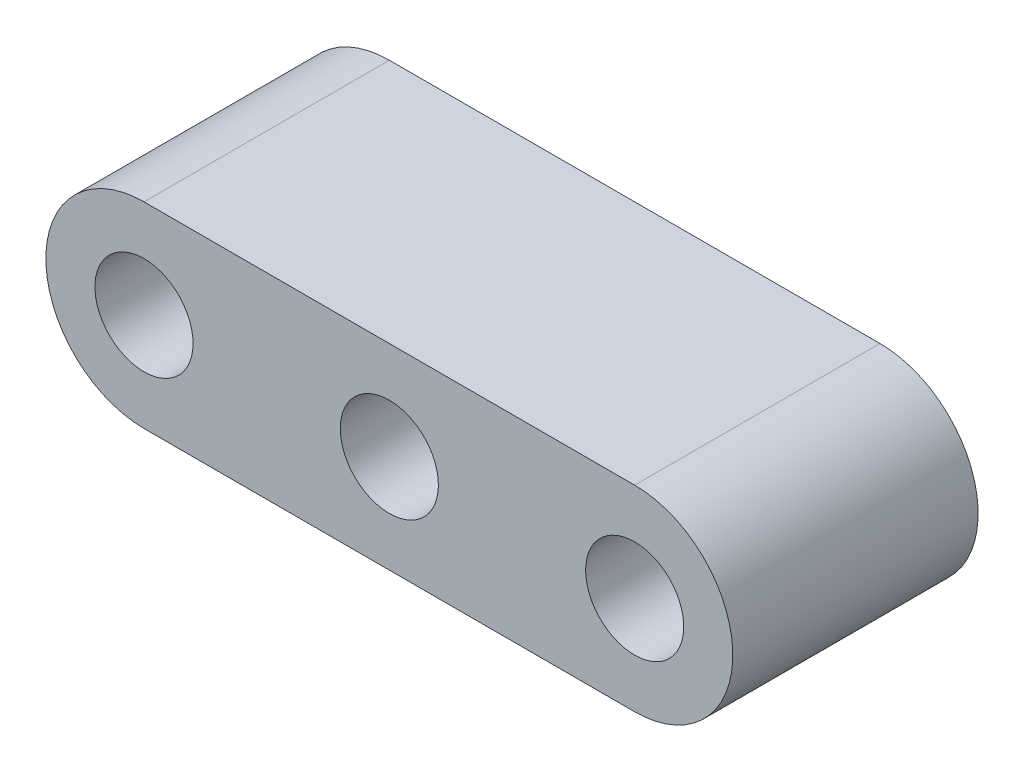
ISO-10303-21;
HEADER;
FILE_DESCRIPTION(('STEP AP214'),'2;1');
FILE_NAME('part.step','',(''),(''),'','','');
FILE_SCHEMA(('AUTOMOTIVE_DESIGN { 1 0 10303 214 1 1 1 1 }'));
ENDSEC;
DATA;
#1=APPLICATION_CONTEXT('core data for automotive mechanical design processes');
#2=APPLICATION_PROTOCOL_DEFINITION('international standard','automotive_design',2000,#1);
#3=PRODUCT_CONTEXT('',#1,'mechanical');
#4=PRODUCT('Part','Part','',(#3));
#5=PRODUCT_RELATED_PRODUCT_CATEGORY('part','',(#4));
#6=PRODUCT_DEFINITION_FORMATION('','',#4);
#7=PRODUCT_DEFINITION_CONTEXT('part definition',#1,'design');
#8=PRODUCT_DEFINITION('design','',#6,#7);
#9=PRODUCT_DEFINITION_SHAPE('','',#8);
#10=(LENGTH_UNIT() NAMED_UNIT(*) SI_UNIT(.MILLI.,.METRE.));
#11=(NAMED_UNIT(*) PLANE_ANGLE_UNIT() SI_UNIT($,.RADIAN.));
#12=(NAMED_UNIT(*) SI_UNIT($,.STERADIAN.) SOLID_ANGLE_UNIT());
#13=UNCERTAINTY_MEASURE_WITH_UNIT(LENGTH_MEASURE(1.E-05),#10,'distance_accuracy_value','');
#14=(GEOMETRIC_REPRESENTATION_CONTEXT(3) GLOBAL_UNCERTAINTY_ASSIGNED_CONTEXT((#13)) GLOBAL_UNIT_ASSIGNED_CONTEXT((#10,
#11,#12)) REPRESENTATION_CONTEXT('',''));
#15=CARTESIAN_POINT('',(0.,0.,0.));
#16=DIRECTION('',(0.,0.,1.));
#17=DIRECTION('',(1.,0.,0.));
#18=AXIS2_PLACEMENT_3D('',#15,#16,#17);
#19=CARTESIAN_POINT('',(-10.,0.,10.));
#20=DIRECTION('',(0.,0.,1.));
#21=DIRECTION('',(1.,0.,0.));
#22=AXIS2_PLACEMENT_3D('',#19,#20,#21);
#23=PLANE('',#22);
#24=CARTESIAN_POINT('',(0.,0.,10.));
#25=DIRECTION('',(0.,0.,1.));
#26=DIRECTION('',(1.,0.,0.));
#27=AXIS2_PLACEMENT_3D('',#24,#25,#26);
#28=CIRCLE('',#27,2.);
#29=CARTESIAN_POINT('',(2.,0.,10.));
#30=VERTEX_POINT('',#29);
#31=EDGE_CURVE('E116',#30,#30,#28,.T.);
#32=ORIENTED_EDGE('',*,*,#31,.F.);
#33=EDGE_LOOP('',(#32));
#34=FACE_BOUND('',#33,.T.);
#35=CARTESIAN_POINT('',(-10.,0.,10.));
#36=DIRECTION('',(0.,0.,1.));
#37=DIRECTION('',(1.,0.,0.));
#38=AXIS2_PLACEMENT_3D('',#35,#36,#37);
#39=CIRCLE('',#38,4.);
#40=CARTESIAN_POINT('',(-10.,4.,10.));
#41=VERTEX_POINT('',#40);
#42=CARTESIAN_POINT('',(-10.,-4.,10.));
#43=VERTEX_POINT('',#42);
#44=EDGE_CURVE('E86',#41,#43,#39,.T.);
#45=ORIENTED_EDGE('',*,*,#44,.T.);
#46=DIRECTION('',(1.,0.,0.));
#47=VECTOR('',#46,1.);
#48=CARTESIAN_POINT('',(-10.,-4.,10.));
#49=LINE('',#48,#47);
#50=CARTESIAN_POINT('',(10.,-4.,10.));
#51=VERTEX_POINT('',#50);
#52=EDGE_CURVE('E81',#43,#51,#49,.T.);
#53=ORIENTED_EDGE('',*,*,#52,.T.);
#54=CARTESIAN_POINT('',(10.,0.,10.));
#55=DIRECTION('',(0.,0.,1.));
#56=DIRECTION('',(-1.,0.,0.));
#57=AXIS2_PLACEMENT_3D('',#54,#55,#56);
#58=CIRCLE('',#57,4.);
#59=CARTESIAN_POINT('',(10.,4.,10.));
#60=VERTEX_POINT('',#59);
#61=EDGE_CURVE('E84',#51,#60,#58,.T.);
#62=ORIENTED_EDGE('',*,*,#61,.T.);
#63=DIRECTION('',(-1.,0.,0.));
#64=VECTOR('',#63,1.);
#65=CARTESIAN_POINT('',(-10.,4.,10.));
#66=LINE('',#65,#64);
#67=EDGE_CURVE('E51',#60,#41,#66,.T.);
#68=ORIENTED_EDGE('',*,*,#67,.T.);
#69=EDGE_LOOP('',(#45,#53,#62,#68));
#70=FACE_BOUND('',#69,.T.);
#71=CARTESIAN_POINT('',(-10.,0.,10.));
#72=DIRECTION('',(0.,0.,1.));
#73=DIRECTION('',(1.,0.,0.));
#74=AXIS2_PLACEMENT_3D('',#71,#72,#73);
#75=CIRCLE('',#74,2.);
#76=CARTESIAN_POINT('',(-8.,0.,10.));
#77=VERTEX_POINT('',#76);
#78=EDGE_CURVE('E101',#77,#77,#75,.T.);
#79=ORIENTED_EDGE('',*,*,#78,.F.);
#80=EDGE_LOOP('',(#79));
#81=FACE_BOUND('',#80,.T.);
#82=CARTESIAN_POINT('',(10.,0.,10.));
#83=DIRECTION('',(0.,0.,1.));
#84=DIRECTION('',(-1.,0.,0.));
#85=AXIS2_PLACEMENT_3D('',#82,#83,#84);
#86=CIRCLE('',#85,2.);
#87=CARTESIAN_POINT('',(8.,0.,10.));
#88=VERTEX_POINT('',#87);
#89=EDGE_CURVE('E122',#88,#88,#86,.T.);
#90=ORIENTED_EDGE('',*,*,#89,.F.);
#91=EDGE_LOOP('',(#90));
#92=FACE_BOUND('',#91,.T.);
#93=ADVANCED_FACE('F34',(#34,#70,#81,#92),#23,.T.);
#94=CARTESIAN_POINT('',(-10.,0.,0.));
#95=DIRECTION('',(0.,0.,1.));
#96=DIRECTION('',(1.,0.,0.));
#97=AXIS2_PLACEMENT_3D('',#94,#95,#96);
#98=PLANE('',#97);
#99=CARTESIAN_POINT('',(-10.,0.,0.));
#100=DIRECTION('',(0.,0.,1.));
#101=DIRECTION('',(1.,0.,0.));
#102=AXIS2_PLACEMENT_3D('',#99,#100,#101);
#103=CIRCLE('',#102,4.);
#104=CARTESIAN_POINT('',(-10.,4.,0.));
#105=VERTEX_POINT('',#104);
#106=CARTESIAN_POINT('',(-10.,-4.,0.));
#107=VERTEX_POINT('',#106);
#108=EDGE_CURVE('E98',#105,#107,#103,.T.);
#109=ORIENTED_EDGE('',*,*,#108,.F.);
#110=DIRECTION('',(-1.,0.,0.));
#111=VECTOR('',#110,1.);
#112=CARTESIAN_POINT('',(-10.,4.,0.));
#113=LINE('',#112,#111);
#114=CARTESIAN_POINT('',(10.,4.,0.));
#115=VERTEX_POINT('',#114);
#116=EDGE_CURVE('E74',#115,#105,#113,.T.);
#117=ORIENTED_EDGE('',*,*,#116,.F.);
#118=CARTESIAN_POINT('',(10.,0.,0.));
#119=DIRECTION('',(0.,0.,1.));
#120=DIRECTION('',(-1.,0.,0.));
#121=AXIS2_PLACEMENT_3D('',#118,#119,#120);
#122=CIRCLE('',#121,4.);
#123=CARTESIAN_POINT('',(10.,-4.,0.));
#124=VERTEX_POINT('',#123);
#125=EDGE_CURVE('E68',#124,#115,#122,.T.);
#126=ORIENTED_EDGE('',*,*,#125,.F.);
#127=DIRECTION('',(1.,0.,0.));
#128=VECTOR('',#127,1.);
#129=CARTESIAN_POINT('',(-10.,-4.,0.));
#130=LINE('',#129,#128);
#131=EDGE_CURVE('E90',#107,#124,#130,.T.);
#132=ORIENTED_EDGE('',*,*,#131,.F.);
#133=EDGE_LOOP('',(#109,#117,#126,#132));
#134=FACE_BOUND('',#133,.T.);
#135=CARTESIAN_POINT('',(-10.,0.,0.));
#136=DIRECTION('',(0.,0.,1.));
#137=DIRECTION('',(1.,0.,0.));
#138=AXIS2_PLACEMENT_3D('',#135,#136,#137);
#139=CIRCLE('',#138,2.);
#140=CARTESIAN_POINT('',(-8.,0.,0.));
#141=VERTEX_POINT('',#140);
#142=EDGE_CURVE('E113',#141,#141,#139,.T.);
#143=ORIENTED_EDGE('',*,*,#142,.T.);
#144=EDGE_LOOP('',(#143));
#145=FACE_BOUND('',#144,.T.);
#146=CARTESIAN_POINT('',(0.,0.,0.));
#147=DIRECTION('',(0.,0.,1.));
#148=DIRECTION('',(1.,0.,0.));
#149=AXIS2_PLACEMENT_3D('',#146,#147,#148);
#150=CIRCLE('',#149,2.);
#151=CARTESIAN_POINT('',(2.,0.,0.));
#152=VERTEX_POINT('',#151);
#153=EDGE_CURVE('E119',#152,#152,#150,.T.);
#154=ORIENTED_EDGE('',*,*,#153,.T.);
#155=EDGE_LOOP('',(#154));
#156=FACE_BOUND('',#155,.T.);
#157=CARTESIAN_POINT('',(10.,0.,0.));
#158=DIRECTION('',(0.,0.,1.));
#159=DIRECTION('',(-1.,0.,0.));
#160=AXIS2_PLACEMENT_3D('',#157,#158,#159);
#161=CIRCLE('',#160,2.);
#162=CARTESIAN_POINT('',(8.,0.,0.));
#163=VERTEX_POINT('',#162);
#164=EDGE_CURVE('E125',#163,#163,#161,.T.);
#165=ORIENTED_EDGE('',*,*,#164,.T.);
#166=EDGE_LOOP('',(#165));
#167=FACE_BOUND('',#166,.T.);
#168=ADVANCED_FACE('F109',(#134,#145,#156,#167),#98,.F.);
#169=CARTESIAN_POINT('',(-10.,0.,10.));
#170=DIRECTION('',(0.,0.,-1.));
#171=DIRECTION('',(-1.,0.,0.));
#172=AXIS2_PLACEMENT_3D('',#169,#170,#171);
#173=CYLINDRICAL_SURFACE('',#172,4.);
#174=ORIENTED_EDGE('',*,*,#108,.T.);
#175=DIRECTION('',(0.,0.,-1.));
#176=VECTOR('',#175,1.);
#177=CARTESIAN_POINT('',(-10.,-4.,10.));
#178=LINE('',#177,#176);
#179=EDGE_CURVE('E11',#43,#107,#178,.T.);
#180=ORIENTED_EDGE('',*,*,#179,.F.);
#181=ORIENTED_EDGE('',*,*,#44,.F.);
#182=DIRECTION('',(0.,0.,-1.));
#183=VECTOR('',#182,1.);
#184=CARTESIAN_POINT('',(-10.,4.,10.));
#185=LINE('',#184,#183);
#186=EDGE_CURVE('E94',#41,#105,#185,.T.);
#187=ORIENTED_EDGE('',*,*,#186,.T.);
#188=EDGE_LOOP('',(#174,#180,#181,#187));
#189=FACE_BOUND('',#188,.T.);
#190=ADVANCED_FACE('F36',(#189),#173,.T.);
#191=CARTESIAN_POINT('',(-10.,-4.,10.));
#192=DIRECTION('',(0.,1.,0.));
#193=DIRECTION('',(0.,0.,1.));
#194=AXIS2_PLACEMENT_3D('',#191,#192,#193);
#195=PLANE('',#194);
#196=ORIENTED_EDGE('',*,*,#131,.T.);
#197=DIRECTION('',(0.,0.,-1.));
#198=VECTOR('',#197,1.);
#199=CARTESIAN_POINT('',(10.,-4.,10.));
#200=LINE('',#199,#198);
#201=EDGE_CURVE('E43',#51,#124,#200,.T.);
#202=ORIENTED_EDGE('',*,*,#201,.F.);
#203=ORIENTED_EDGE('',*,*,#52,.F.);
#204=ORIENTED_EDGE('',*,*,#179,.T.);
#205=EDGE_LOOP('',(#196,#202,#203,#204));
#206=FACE_BOUND('',#205,.T.);
#207=ADVANCED_FACE('F89',(#206),#195,.F.);
#208=CARTESIAN_POINT('',(10.,0.,10.));
#209=DIRECTION('',(0.,0.,-1.));
#210=DIRECTION('',(-1.,0.,0.));
#211=AXIS2_PLACEMENT_3D('',#208,#209,#210);
#212=CYLINDRICAL_SURFACE('',#211,4.);
#213=ORIENTED_EDGE('',*,*,#125,.T.);
#214=DIRECTION('',(0.,0.,-1.));
#215=VECTOR('',#214,1.);
#216=CARTESIAN_POINT('',(10.,4.,10.));
#217=LINE('',#216,#215);
#218=EDGE_CURVE('E91',#60,#115,#217,.T.);
#219=ORIENTED_EDGE('',*,*,#218,.F.);
#220=ORIENTED_EDGE('',*,*,#61,.F.);
#221=ORIENTED_EDGE('',*,*,#201,.T.);
#222=EDGE_LOOP('',(#213,#219,#220,#221));
#223=FACE_BOUND('',#222,.T.);
#224=ADVANCED_FACE('F92',(#223),#212,.T.);
#225=CARTESIAN_POINT('',(-10.,4.,10.));
#226=DIRECTION('',(0.,-1.,0.));
#227=DIRECTION('',(0.,0.,-1.));
#228=AXIS2_PLACEMENT_3D('',#225,#226,#227);
#229=PLANE('',#228);
#230=ORIENTED_EDGE('',*,*,#116,.T.);
#231=ORIENTED_EDGE('',*,*,#186,.F.);
#232=ORIENTED_EDGE('',*,*,#67,.F.);
#233=ORIENTED_EDGE('',*,*,#218,.T.);
#234=EDGE_LOOP('',(#230,#231,#232,#233));
#235=FACE_BOUND('',#234,.T.);
#236=ADVANCED_FACE('F106',(#235),#229,.F.);
#237=CARTESIAN_POINT('',(-10.,0.,10.));
#238=DIRECTION('',(0.,0.,-1.));
#239=DIRECTION('',(-1.,0.,0.));
#240=AXIS2_PLACEMENT_3D('',#237,#238,#239);
#241=CYLINDRICAL_SURFACE('',#240,2.);
#242=ORIENTED_EDGE('',*,*,#78,.T.);
#243=EDGE_LOOP('',(#242));
#244=FACE_BOUND('',#243,.T.);
#245=ORIENTED_EDGE('',*,*,#142,.F.);
#246=EDGE_LOOP('',(#245));
#247=FACE_BOUND('',#246,.T.);
#248=ADVANCED_FACE('F143',(#244,#247),#241,.F.);
#249=CARTESIAN_POINT('',(0.,0.,10.));
#250=DIRECTION('',(0.,0.,-1.));
#251=DIRECTION('',(-1.,0.,0.));
#252=AXIS2_PLACEMENT_3D('',#249,#250,#251);
#253=CYLINDRICAL_SURFACE('',#252,2.);
#254=ORIENTED_EDGE('',*,*,#31,.T.);
#255=EDGE_LOOP('',(#254));
#256=FACE_BOUND('',#255,.T.);
#257=ORIENTED_EDGE('',*,*,#153,.F.);
#258=EDGE_LOOP('',(#257));
#259=FACE_BOUND('',#258,.T.);
#260=ADVANCED_FACE('F189',(#256,#259),#253,.F.);
#261=CARTESIAN_POINT('',(10.,0.,10.));
#262=DIRECTION('',(0.,0.,-1.));
#263=DIRECTION('',(-1.,0.,0.));
#264=AXIS2_PLACEMENT_3D('',#261,#262,#263);
#265=CYLINDRICAL_SURFACE('',#264,2.);
#266=ORIENTED_EDGE('',*,*,#89,.T.);
#267=EDGE_LOOP('',(#266));
#268=FACE_BOUND('',#267,.T.);
#269=ORIENTED_EDGE('',*,*,#164,.F.);
#270=EDGE_LOOP('',(#269));
#271=FACE_BOUND('',#270,.T.);
#272=ADVANCED_FACE('F131',(#268,#271),#265,.F.);
#273=CLOSED_SHELL('',(#93,#168,#190,#207,#224,#236,#248,#260,#272));
#274=MANIFOLD_SOLID_BREP('B2',#273);
#275=ADVANCED_BREP_SHAPE_REPRESENTATION('',(#18,#274),#14);
#276=SHAPE_DEFINITION_REPRESENTATION(#9,#275);
ENDSEC;
END-ISO-10303-21;
